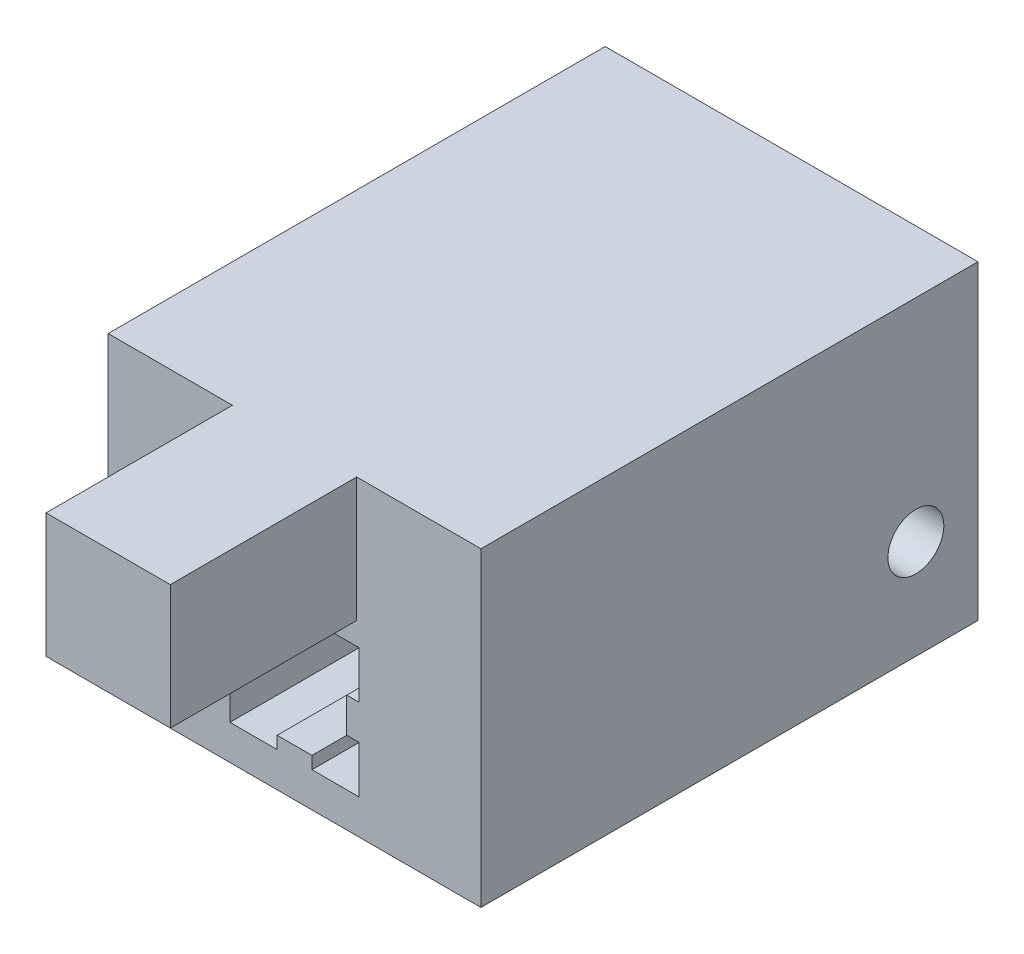
ISO-10303-21;
HEADER;
FILE_DESCRIPTION(('STEP AP214'),'2;1');
FILE_NAME('part.step','',(''),(''),'','','');
FILE_SCHEMA(('AUTOMOTIVE_DESIGN { 1 0 10303 214 1 1 1 1 }'));
ENDSEC;
DATA;
#1=APPLICATION_CONTEXT('core data for automotive mechanical design processes');
#2=APPLICATION_PROTOCOL_DEFINITION('international standard','automotive_design',2000,#1);
#3=PRODUCT_CONTEXT('',#1,'mechanical');
#4=PRODUCT('Part','Part','',(#3));
#5=PRODUCT_RELATED_PRODUCT_CATEGORY('part','',(#4));
#6=PRODUCT_DEFINITION_FORMATION('','',#4);
#7=PRODUCT_DEFINITION_CONTEXT('part definition',#1,'design');
#8=PRODUCT_DEFINITION('design','',#6,#7);
#9=PRODUCT_DEFINITION_SHAPE('','',#8);
#10=(LENGTH_UNIT() NAMED_UNIT(*) SI_UNIT(.MILLI.,.METRE.));
#11=(NAMED_UNIT(*) PLANE_ANGLE_UNIT() SI_UNIT($,.RADIAN.));
#12=(NAMED_UNIT(*) SI_UNIT($,.STERADIAN.) SOLID_ANGLE_UNIT());
#13=UNCERTAINTY_MEASURE_WITH_UNIT(LENGTH_MEASURE(1.E-05),#10,'distance_accuracy_value','');
#14=(GEOMETRIC_REPRESENTATION_CONTEXT(3) GLOBAL_UNCERTAINTY_ASSIGNED_CONTEXT((#13)) GLOBAL_UNIT_ASSIGNED_CONTEXT((#10,
#11,#12)) REPRESENTATION_CONTEXT('',''));
#15=CARTESIAN_POINT('',(0.,0.,0.));
#16=DIRECTION('',(0.,0.,1.));
#17=DIRECTION('',(1.,0.,0.));
#18=AXIS2_PLACEMENT_3D('',#15,#16,#17);
#19=CARTESIAN_POINT('',(-15.,12.5,40.));
#20=DIRECTION('',(1.,0.,0.));
#21=DIRECTION('',(0.,1.,0.));
#22=AXIS2_PLACEMENT_3D('',#19,#20,#21);
#23=PLANE('',#22);
#24=CARTESIAN_POINT('',(-15.,-4.50000000000001,5.));
#25=DIRECTION('',(-1.,0.,0.));
#26=DIRECTION('',(0.,-1.,0.));
#27=AXIS2_PLACEMENT_3D('',#24,#25,#26);
#28=CIRCLE('',#27,2.25);
#29=CARTESIAN_POINT('',(-15.,-6.75000000000001,5.));
#30=VERTEX_POINT('',#29);
#31=EDGE_CURVE('E247',#30,#30,#28,.T.);
#32=ORIENTED_EDGE('',*,*,#31,.F.);
#33=EDGE_LOOP('',(#32));
#34=FACE_BOUND('',#33,.T.);
#35=DIRECTION('',(0.,-1.,0.));
#36=VECTOR('',#35,1.);
#37=CARTESIAN_POINT('',(-15.,12.5,0.));
#38=LINE('',#37,#36);
#39=CARTESIAN_POINT('',(-15.,12.5,0.));
#40=VERTEX_POINT('',#39);
#41=CARTESIAN_POINT('',(-15.,-12.5,0.));
#42=VERTEX_POINT('',#41);
#43=EDGE_CURVE('E376',#40,#42,#38,.T.);
#44=ORIENTED_EDGE('',*,*,#43,.T.);
#45=DIRECTION('',(0.,0.,-1.));
#46=VECTOR('',#45,1.);
#47=CARTESIAN_POINT('',(-15.,-12.5,40.));
#48=LINE('',#47,#46);
#49=CARTESIAN_POINT('',(-15.,-12.5,40.));
#50=VERTEX_POINT('',#49);
#51=EDGE_CURVE('E11',#50,#42,#48,.T.);
#52=ORIENTED_EDGE('',*,*,#51,.F.);
#53=DIRECTION('',(0.,-1.,0.));
#54=VECTOR('',#53,1.);
#55=CARTESIAN_POINT('',(-15.,12.5,40.));
#56=LINE('',#55,#54);
#57=CARTESIAN_POINT('',(-15.,12.5,40.));
#58=VERTEX_POINT('',#57);
#59=EDGE_CURVE('E415',#58,#50,#56,.T.);
#60=ORIENTED_EDGE('',*,*,#59,.F.);
#61=DIRECTION('',(0.,0.,-1.));
#62=VECTOR('',#61,1.);
#63=CARTESIAN_POINT('',(-15.,12.5,40.));
#64=LINE('',#63,#62);
#65=EDGE_CURVE('E426',#58,#40,#64,.T.);
#66=ORIENTED_EDGE('',*,*,#65,.T.);
#67=EDGE_LOOP('',(#44,#52,#60,#66));
#68=FACE_BOUND('',#67,.T.);
#69=ADVANCED_FACE('F33',(#34,#68),#23,.F.);
#70=CARTESIAN_POINT('',(-15.,-12.5,40.));
#71=DIRECTION('',(0.,1.,0.));
#72=DIRECTION('',(0.,0.,1.));
#73=AXIS2_PLACEMENT_3D('',#70,#71,#72);
#74=PLANE('',#73);
#75=DIRECTION('',(1.,0.,0.));
#76=VECTOR('',#75,1.);
#77=CARTESIAN_POINT('',(-15.,-12.5,0.));
#78=LINE('',#77,#76);
#79=CARTESIAN_POINT('',(15.,-12.5,0.));
#80=VERTEX_POINT('',#79);
#81=EDGE_CURVE('E429',#42,#80,#78,.T.);
#82=ORIENTED_EDGE('',*,*,#81,.T.);
#83=DIRECTION('',(0.,0.,-1.));
#84=VECTOR('',#83,1.);
#85=CARTESIAN_POINT('',(15.,-12.5,40.));
#86=LINE('',#85,#84);
#87=CARTESIAN_POINT('',(15.,-12.5,40.));
#88=VERTEX_POINT('',#87);
#89=EDGE_CURVE('E40',#88,#80,#86,.T.);
#90=ORIENTED_EDGE('',*,*,#89,.F.);
#91=DIRECTION('',(1.,0.,0.));
#92=VECTOR('',#91,1.);
#93=CARTESIAN_POINT('',(-15.,-12.5,40.));
#94=LINE('',#93,#92);
#95=EDGE_CURVE('E418',#50,#88,#94,.T.);
#96=ORIENTED_EDGE('',*,*,#95,.F.);
#97=ORIENTED_EDGE('',*,*,#51,.T.);
#98=EDGE_LOOP('',(#82,#90,#96,#97));
#99=FACE_BOUND('',#98,.T.);
#100=ADVANCED_FACE('F480',(#99),#74,.F.);
#101=CARTESIAN_POINT('',(15.,12.5,40.));
#102=DIRECTION('',(-1.,0.,0.));
#103=DIRECTION('',(0.,-1.,0.));
#104=AXIS2_PLACEMENT_3D('',#101,#102,#103);
#105=PLANE('',#104);
#106=CARTESIAN_POINT('',(15.,-4.5,5.));
#107=DIRECTION('',(1.,0.,0.));
#108=DIRECTION('',(0.,1.,0.));
#109=AXIS2_PLACEMENT_3D('',#106,#107,#108);
#110=CIRCLE('',#109,2.25);
#111=CARTESIAN_POINT('',(15.,-2.25,5.));
#112=VERTEX_POINT('',#111);
#113=EDGE_CURVE('E237',#112,#112,#110,.T.);
#114=ORIENTED_EDGE('',*,*,#113,.F.);
#115=EDGE_LOOP('',(#114));
#116=FACE_BOUND('',#115,.T.);
#117=DIRECTION('',(0.,1.,0.));
#118=VECTOR('',#117,1.);
#119=CARTESIAN_POINT('',(15.,12.5,0.));
#120=LINE('',#119,#118);
#121=CARTESIAN_POINT('',(15.,12.5,0.));
#122=VERTEX_POINT('',#121);
#123=EDGE_CURVE('E431',#80,#122,#120,.T.);
#124=ORIENTED_EDGE('',*,*,#123,.T.);
#125=DIRECTION('',(0.,0.,-1.));
#126=VECTOR('',#125,1.);
#127=CARTESIAN_POINT('',(15.,12.5,40.));
#128=LINE('',#127,#126);
#129=CARTESIAN_POINT('',(15.,12.5,40.));
#130=VERTEX_POINT('',#129);
#131=EDGE_CURVE('E436',#130,#122,#128,.T.);
#132=ORIENTED_EDGE('',*,*,#131,.F.);
#133=DIRECTION('',(0.,1.,0.));
#134=VECTOR('',#133,1.);
#135=CARTESIAN_POINT('',(15.,12.5,40.));
#136=LINE('',#135,#134);
#137=EDGE_CURVE('E421',#88,#130,#136,.T.);
#138=ORIENTED_EDGE('',*,*,#137,.F.);
#139=ORIENTED_EDGE('',*,*,#89,.T.);
#140=EDGE_LOOP('',(#124,#132,#138,#139));
#141=FACE_BOUND('',#140,.T.);
#142=ADVANCED_FACE('F443',(#116,#141),#105,.F.);
#143=CARTESIAN_POINT('',(-15.,12.5,40.));
#144=DIRECTION('',(0.,-1.,0.));
#145=DIRECTION('',(0.,0.,-1.));
#146=AXIS2_PLACEMENT_3D('',#143,#144,#145);
#147=PLANE('',#146);
#148=DIRECTION('',(-1.,0.,0.));
#149=VECTOR('',#148,1.);
#150=CARTESIAN_POINT('',(-15.,12.5,0.));
#151=LINE('',#150,#149);
#152=EDGE_CURVE('E419',#122,#40,#151,.T.);
#153=ORIENTED_EDGE('',*,*,#152,.T.);
#154=ORIENTED_EDGE('',*,*,#65,.F.);
#155=DIRECTION('',(-1.,0.,0.));
#156=VECTOR('',#155,1.);
#157=CARTESIAN_POINT('',(-15.,12.5,40.));
#158=LINE('',#157,#156);
#159=CARTESIAN_POINT('',(-5.,12.5,40.));
#160=VERTEX_POINT('',#159);
#161=EDGE_CURVE('E423',#160,#58,#158,.T.);
#162=ORIENTED_EDGE('',*,*,#161,.F.);
#163=DIRECTION('',(0.,0.,-1.));
#164=VECTOR('',#163,1.);
#165=CARTESIAN_POINT('',(-5.,12.5,55.));
#166=LINE('',#165,#164);
#167=CARTESIAN_POINT('',(-5.,12.5,55.));
#168=VERTEX_POINT('',#167);
#169=EDGE_CURVE('E459',#168,#160,#166,.T.);
#170=ORIENTED_EDGE('',*,*,#169,.F.);
#171=DIRECTION('',(-1.,0.,0.));
#172=VECTOR('',#171,1.);
#173=CARTESIAN_POINT('',(-5.,12.5,55.));
#174=LINE('',#173,#172);
#175=CARTESIAN_POINT('',(5.,12.5,55.));
#176=VERTEX_POINT('',#175);
#177=EDGE_CURVE('E230',#176,#168,#174,.T.);
#178=ORIENTED_EDGE('',*,*,#177,.F.);
#179=DIRECTION('',(0.,0.,-1.));
#180=VECTOR('',#179,1.);
#181=CARTESIAN_POINT('',(5.,12.5,55.));
#182=LINE('',#181,#180);
#183=CARTESIAN_POINT('',(4.99999999999999,12.5,40.));
#184=VERTEX_POINT('',#183);
#185=EDGE_CURVE('E242',#176,#184,#182,.T.);
#186=ORIENTED_EDGE('',*,*,#185,.T.);
#187=EDGE_CURVE('E424',#130,#184,#158,.T.);
#188=ORIENTED_EDGE('',*,*,#187,.F.);
#189=ORIENTED_EDGE('',*,*,#131,.T.);
#190=EDGE_LOOP('',(#153,#154,#162,#170,#178,#186,#188,#189));
#191=FACE_BOUND('',#190,.T.);
#192=ADVANCED_FACE('F452',(#191),#147,.F.);
#193=CARTESIAN_POINT('',(0.,0.,40.));
#194=DIRECTION('',(0.,0.,1.));
#195=DIRECTION('',(1.,0.,0.));
#196=AXIS2_PLACEMENT_3D('',#193,#194,#195);
#197=PLANE('',#196);
#198=DIRECTION('',(0.,-1.,0.));
#199=VECTOR('',#198,1.);
#200=CARTESIAN_POINT('',(-5.,12.5,40.));
#201=LINE('',#200,#199);
#202=CARTESIAN_POINT('',(-4.99999999999999,2.5,40.));
#203=VERTEX_POINT('',#202);
#204=EDGE_CURVE('E52',#160,#203,#201,.T.);
#205=ORIENTED_EDGE('',*,*,#204,.F.);
#206=ORIENTED_EDGE('',*,*,#161,.T.);
#207=ORIENTED_EDGE('',*,*,#59,.T.);
#208=ORIENTED_EDGE('',*,*,#95,.T.);
#209=ORIENTED_EDGE('',*,*,#137,.T.);
#210=ORIENTED_EDGE('',*,*,#187,.T.);
#211=DIRECTION('',(0.,1.,0.));
#212=VECTOR('',#211,1.);
#213=CARTESIAN_POINT('',(5.,12.5,40.));
#214=LINE('',#213,#212);
#215=CARTESIAN_POINT('',(5.,2.5,40.));
#216=VERTEX_POINT('',#215);
#217=EDGE_CURVE('E234',#216,#184,#214,.T.);
#218=ORIENTED_EDGE('',*,*,#217,.F.);
#219=DIRECTION('',(1.,0.,0.));
#220=VECTOR('',#219,1.);
#221=CARTESIAN_POINT('',(-4.99999999999999,2.5,40.));
#222=LINE('',#221,#220);
#223=EDGE_CURVE('E47',#203,#216,#222,.T.);
#224=ORIENTED_EDGE('',*,*,#223,.F.);
#225=EDGE_LOOP('',(#205,#206,#207,#208,#209,#210,#218,#224));
#226=FACE_BOUND('',#225,.T.);
#227=DIRECTION('',(1.,0.,0.));
#228=VECTOR('',#227,1.);
#229=CARTESIAN_POINT('',(1.4,0.699999999999995,40.));
#230=LINE('',#229,#228);
#231=CARTESIAN_POINT('',(1.4,0.699999999999995,40.));
#232=VERTEX_POINT('',#231);
#233=CARTESIAN_POINT('',(5.19999999999999,0.700000000000001,40.));
#234=VERTEX_POINT('',#233);
#235=EDGE_CURVE('E255',#232,#234,#230,.T.);
#236=ORIENTED_EDGE('',*,*,#235,.T.);
#237=DIRECTION('',(0.,-1.,0.));
#238=VECTOR('',#237,1.);
#239=CARTESIAN_POINT('',(5.19999999999999,0.700000000000001,40.));
#240=LINE('',#239,#238);
#241=CARTESIAN_POINT('',(5.2,-3.1,40.));
#242=VERTEX_POINT('',#241);
#243=EDGE_CURVE('E258',#234,#242,#240,.T.);
#244=ORIENTED_EDGE('',*,*,#243,.T.);
#245=DIRECTION('',(-1.,0.,0.));
#246=VECTOR('',#245,1.);
#247=CARTESIAN_POINT('',(5.2,-3.1,40.));
#248=LINE('',#247,#246);
#249=CARTESIAN_POINT('',(4.2,-3.1,40.));
#250=VERTEX_POINT('',#249);
#251=EDGE_CURVE('E262',#242,#250,#248,.T.);
#252=ORIENTED_EDGE('',*,*,#251,.T.);
#253=DIRECTION('',(0.,-1.,0.));
#254=VECTOR('',#253,1.);
#255=CARTESIAN_POINT('',(4.2,-3.1,40.));
#256=LINE('',#255,#254);
#257=CARTESIAN_POINT('',(4.2,-5.9,40.));
#258=VERTEX_POINT('',#257);
#259=EDGE_CURVE('E265',#250,#258,#256,.T.);
#260=ORIENTED_EDGE('',*,*,#259,.T.);
#261=DIRECTION('',(1.,0.,0.));
#262=VECTOR('',#261,1.);
#263=CARTESIAN_POINT('',(4.2,-5.9,40.));
#264=LINE('',#263,#262);
#265=CARTESIAN_POINT('',(5.2,-5.9,40.));
#266=VERTEX_POINT('',#265);
#267=EDGE_CURVE('E268',#258,#266,#264,.T.);
#268=ORIENTED_EDGE('',*,*,#267,.T.);
#269=DIRECTION('',(0.,-1.,0.));
#270=VECTOR('',#269,1.);
#271=CARTESIAN_POINT('',(5.2,-5.9,40.));
#272=LINE('',#271,#270);
#273=CARTESIAN_POINT('',(5.20000000000001,-9.7,40.));
#274=VERTEX_POINT('',#273);
#275=EDGE_CURVE('E271',#266,#274,#272,.T.);
#276=ORIENTED_EDGE('',*,*,#275,.T.);
#277=DIRECTION('',(-1.,0.,0.));
#278=VECTOR('',#277,1.);
#279=CARTESIAN_POINT('',(5.20000000000001,-9.7,40.));
#280=LINE('',#279,#278);
#281=CARTESIAN_POINT('',(1.4,-9.7,40.));
#282=VERTEX_POINT('',#281);
#283=EDGE_CURVE('E274',#274,#282,#280,.T.);
#284=ORIENTED_EDGE('',*,*,#283,.T.);
#285=DIRECTION('',(0.,1.,0.));
#286=VECTOR('',#285,1.);
#287=CARTESIAN_POINT('',(1.4,-9.7,40.));
#288=LINE('',#287,#286);
#289=CARTESIAN_POINT('',(1.4,-8.7,40.));
#290=VERTEX_POINT('',#289);
#291=EDGE_CURVE('E277',#282,#290,#288,.T.);
#292=ORIENTED_EDGE('',*,*,#291,.T.);
#293=DIRECTION('',(-1.,0.,0.));
#294=VECTOR('',#293,1.);
#295=CARTESIAN_POINT('',(1.4,-8.7,40.));
#296=LINE('',#295,#294);
#297=CARTESIAN_POINT('',(-1.4,-8.7,40.));
#298=VERTEX_POINT('',#297);
#299=EDGE_CURVE('E280',#290,#298,#296,.T.);
#300=ORIENTED_EDGE('',*,*,#299,.T.);
#301=DIRECTION('',(0.,-1.,0.));
#302=VECTOR('',#301,1.);
#303=CARTESIAN_POINT('',(-1.4,-8.7,40.));
#304=LINE('',#303,#302);
#305=CARTESIAN_POINT('',(-1.4,-9.7,40.));
#306=VERTEX_POINT('',#305);
#307=EDGE_CURVE('E283',#298,#306,#304,.T.);
#308=ORIENTED_EDGE('',*,*,#307,.T.);
#309=DIRECTION('',(-1.,0.,0.));
#310=VECTOR('',#309,1.);
#311=CARTESIAN_POINT('',(-1.4,-9.7,40.));
#312=LINE('',#311,#310);
#313=CARTESIAN_POINT('',(-5.20000000000001,-9.7,40.));
#314=VERTEX_POINT('',#313);
#315=EDGE_CURVE('E286',#306,#314,#312,.T.);
#316=ORIENTED_EDGE('',*,*,#315,.T.);
#317=DIRECTION('',(0.,1.,0.));
#318=VECTOR('',#317,1.);
#319=CARTESIAN_POINT('',(-5.20000000000001,-9.7,40.));
#320=LINE('',#319,#318);
#321=CARTESIAN_POINT('',(-5.2,-5.9,40.));
#322=VERTEX_POINT('',#321);
#323=EDGE_CURVE('E289',#314,#322,#320,.T.);
#324=ORIENTED_EDGE('',*,*,#323,.T.);
#325=DIRECTION('',(1.,0.,0.));
#326=VECTOR('',#325,1.);
#327=CARTESIAN_POINT('',(-5.2,-5.9,40.));
#328=LINE('',#327,#326);
#329=CARTESIAN_POINT('',(-4.2,-5.9,40.));
#330=VERTEX_POINT('',#329);
#331=EDGE_CURVE('E292',#322,#330,#328,.T.);
#332=ORIENTED_EDGE('',*,*,#331,.T.);
#333=DIRECTION('',(0.,1.,0.));
#334=VECTOR('',#333,1.);
#335=CARTESIAN_POINT('',(-4.2,-5.9,40.));
#336=LINE('',#335,#334);
#337=CARTESIAN_POINT('',(-4.2,-3.1,40.));
#338=VERTEX_POINT('',#337);
#339=EDGE_CURVE('E295',#330,#338,#336,.T.);
#340=ORIENTED_EDGE('',*,*,#339,.T.);
#341=DIRECTION('',(-1.,0.,0.));
#342=VECTOR('',#341,1.);
#343=CARTESIAN_POINT('',(-4.2,-3.1,40.));
#344=LINE('',#343,#342);
#345=CARTESIAN_POINT('',(-5.2,-3.1,40.));
#346=VERTEX_POINT('',#345);
#347=EDGE_CURVE('E298',#338,#346,#344,.T.);
#348=ORIENTED_EDGE('',*,*,#347,.T.);
#349=DIRECTION('',(0.,1.,0.));
#350=VECTOR('',#349,1.);
#351=CARTESIAN_POINT('',(-5.2,-3.1,40.));
#352=LINE('',#351,#350);
#353=CARTESIAN_POINT('',(-5.20000000000001,0.699999999999987,40.));
#354=VERTEX_POINT('',#353);
#355=EDGE_CURVE('E301',#346,#354,#352,.T.);
#356=ORIENTED_EDGE('',*,*,#355,.T.);
#357=DIRECTION('',(1.,0.,0.));
#358=VECTOR('',#357,1.);
#359=CARTESIAN_POINT('',(-5.20000000000001,0.699999999999987,40.));
#360=LINE('',#359,#358);
#361=CARTESIAN_POINT('',(-1.4,0.699999999999995,40.));
#362=VERTEX_POINT('',#361);
#363=EDGE_CURVE('E304',#354,#362,#360,.T.);
#364=ORIENTED_EDGE('',*,*,#363,.T.);
#365=DIRECTION('',(0.,-1.,0.));
#366=VECTOR('',#365,1.);
#367=CARTESIAN_POINT('',(-1.4,0.699999999999995,40.));
#368=LINE('',#367,#366);
#369=CARTESIAN_POINT('',(-1.4,-0.300000000000005,40.));
#370=VERTEX_POINT('',#369);
#371=EDGE_CURVE('E307',#362,#370,#368,.T.);
#372=ORIENTED_EDGE('',*,*,#371,.T.);
#373=DIRECTION('',(1.,0.,0.));
#374=VECTOR('',#373,1.);
#375=CARTESIAN_POINT('',(-1.4,-0.300000000000005,40.));
#376=LINE('',#375,#374);
#377=CARTESIAN_POINT('',(1.4,-0.300000000000005,40.));
#378=VERTEX_POINT('',#377);
#379=EDGE_CURVE('E310',#370,#378,#376,.T.);
#380=ORIENTED_EDGE('',*,*,#379,.T.);
#381=DIRECTION('',(0.,1.,0.));
#382=VECTOR('',#381,1.);
#383=CARTESIAN_POINT('',(1.4,-0.300000000000005,40.));
#384=LINE('',#383,#382);
#385=EDGE_CURVE('E313',#378,#232,#384,.T.);
#386=ORIENTED_EDGE('',*,*,#385,.T.);
#387=EDGE_LOOP('',(#236,#244,#252,#260,#268,#276,#284,#292,#300,#308,#316,#324,#332,#340,#348,
#356,#364,#372,#380,#386));
#388=FACE_BOUND('',#387,.T.);
#389=ADVANCED_FACE('F457',(#226,#388),#197,.T.);
#390=CARTESIAN_POINT('',(0.,0.,0.));
#391=DIRECTION('',(0.,0.,1.));
#392=DIRECTION('',(1.,0.,0.));
#393=AXIS2_PLACEMENT_3D('',#390,#391,#392);
#394=PLANE('',#393);
#395=DIRECTION('',(0.,-1.,0.));
#396=VECTOR('',#395,1.);
#397=CARTESIAN_POINT('',(5.19999999999999,0.700000000000001,0.));
#398=LINE('',#397,#396);
#399=CARTESIAN_POINT('',(5.19999999999999,0.700000000000001,0.));
#400=VERTEX_POINT('',#399);
#401=CARTESIAN_POINT('',(5.2,-3.1,0.));
#402=VERTEX_POINT('',#401);
#403=EDGE_CURVE('E318',#400,#402,#398,.T.);
#404=ORIENTED_EDGE('',*,*,#403,.F.);
#405=DIRECTION('',(1.,0.,0.));
#406=VECTOR('',#405,1.);
#407=CARTESIAN_POINT('',(1.4,0.699999999999995,0.));
#408=LINE('',#407,#406);
#409=CARTESIAN_POINT('',(1.4,0.699999999999995,0.));
#410=VERTEX_POINT('',#409);
#411=EDGE_CURVE('E252',#410,#400,#408,.T.);
#412=ORIENTED_EDGE('',*,*,#411,.F.);
#413=DIRECTION('',(0.,1.,0.));
#414=VECTOR('',#413,1.);
#415=CARTESIAN_POINT('',(1.4,-0.300000000000005,0.));
#416=LINE('',#415,#414);
#417=CARTESIAN_POINT('',(1.4,-0.300000000000005,0.));
#418=VERTEX_POINT('',#417);
#419=EDGE_CURVE('E259',#418,#410,#416,.T.);
#420=ORIENTED_EDGE('',*,*,#419,.F.);
#421=DIRECTION('',(1.,0.,0.));
#422=VECTOR('',#421,1.);
#423=CARTESIAN_POINT('',(-1.4,-0.300000000000005,0.));
#424=LINE('',#423,#422);
#425=CARTESIAN_POINT('',(-1.4,-0.300000000000005,0.));
#426=VERTEX_POINT('',#425);
#427=EDGE_CURVE('E369',#426,#418,#424,.T.);
#428=ORIENTED_EDGE('',*,*,#427,.F.);
#429=DIRECTION('',(0.,-1.,0.));
#430=VECTOR('',#429,1.);
#431=CARTESIAN_POINT('',(-1.4,0.699999999999995,0.));
#432=LINE('',#431,#430);
#433=CARTESIAN_POINT('',(-1.4,0.699999999999995,0.));
#434=VERTEX_POINT('',#433);
#435=EDGE_CURVE('E366',#434,#426,#432,.T.);
#436=ORIENTED_EDGE('',*,*,#435,.F.);
#437=DIRECTION('',(1.,0.,0.));
#438=VECTOR('',#437,1.);
#439=CARTESIAN_POINT('',(-5.20000000000001,0.699999999999987,0.));
#440=LINE('',#439,#438);
#441=CARTESIAN_POINT('',(-5.20000000000001,0.699999999999987,0.));
#442=VERTEX_POINT('',#441);
#443=EDGE_CURVE('E363',#442,#434,#440,.T.);
#444=ORIENTED_EDGE('',*,*,#443,.F.);
#445=DIRECTION('',(0.,1.,0.));
#446=VECTOR('',#445,1.);
#447=CARTESIAN_POINT('',(-5.2,-3.1,0.));
#448=LINE('',#447,#446);
#449=CARTESIAN_POINT('',(-5.2,-3.1,0.));
#450=VERTEX_POINT('',#449);
#451=EDGE_CURVE('E360',#450,#442,#448,.T.);
#452=ORIENTED_EDGE('',*,*,#451,.F.);
#453=DIRECTION('',(-1.,0.,0.));
#454=VECTOR('',#453,1.);
#455=CARTESIAN_POINT('',(-4.2,-3.1,0.));
#456=LINE('',#455,#454);
#457=CARTESIAN_POINT('',(-4.2,-3.1,0.));
#458=VERTEX_POINT('',#457);
#459=EDGE_CURVE('E357',#458,#450,#456,.T.);
#460=ORIENTED_EDGE('',*,*,#459,.F.);
#461=DIRECTION('',(0.,1.,0.));
#462=VECTOR('',#461,1.);
#463=CARTESIAN_POINT('',(-4.2,-5.9,0.));
#464=LINE('',#463,#462);
#465=CARTESIAN_POINT('',(-4.2,-5.9,0.));
#466=VERTEX_POINT('',#465);
#467=EDGE_CURVE('E354',#466,#458,#464,.T.);
#468=ORIENTED_EDGE('',*,*,#467,.F.);
#469=DIRECTION('',(1.,0.,0.));
#470=VECTOR('',#469,1.);
#471=CARTESIAN_POINT('',(-5.2,-5.9,0.));
#472=LINE('',#471,#470);
#473=CARTESIAN_POINT('',(-5.2,-5.9,0.));
#474=VERTEX_POINT('',#473);
#475=EDGE_CURVE('E351',#474,#466,#472,.T.);
#476=ORIENTED_EDGE('',*,*,#475,.F.);
#477=DIRECTION('',(0.,1.,0.));
#478=VECTOR('',#477,1.);
#479=CARTESIAN_POINT('',(-5.20000000000001,-9.7,0.));
#480=LINE('',#479,#478);
#481=CARTESIAN_POINT('',(-5.20000000000001,-9.7,0.));
#482=VERTEX_POINT('',#481);
#483=EDGE_CURVE('E348',#482,#474,#480,.T.);
#484=ORIENTED_EDGE('',*,*,#483,.F.);
#485=DIRECTION('',(-1.,0.,0.));
#486=VECTOR('',#485,1.);
#487=CARTESIAN_POINT('',(-1.4,-9.7,0.));
#488=LINE('',#487,#486);
#489=CARTESIAN_POINT('',(-1.4,-9.7,0.));
#490=VERTEX_POINT('',#489);
#491=EDGE_CURVE('E345',#490,#482,#488,.T.);
#492=ORIENTED_EDGE('',*,*,#491,.F.);
#493=DIRECTION('',(0.,-1.,0.));
#494=VECTOR('',#493,1.);
#495=CARTESIAN_POINT('',(-1.4,-8.7,0.));
#496=LINE('',#495,#494);
#497=CARTESIAN_POINT('',(-1.4,-8.7,0.));
#498=VERTEX_POINT('',#497);
#499=EDGE_CURVE('E342',#498,#490,#496,.T.);
#500=ORIENTED_EDGE('',*,*,#499,.F.);
#501=DIRECTION('',(-1.,0.,0.));
#502=VECTOR('',#501,1.);
#503=CARTESIAN_POINT('',(1.4,-8.7,0.));
#504=LINE('',#503,#502);
#505=CARTESIAN_POINT('',(1.4,-8.7,0.));
#506=VERTEX_POINT('',#505);
#507=EDGE_CURVE('E339',#506,#498,#504,.T.);
#508=ORIENTED_EDGE('',*,*,#507,.F.);
#509=DIRECTION('',(0.,1.,0.));
#510=VECTOR('',#509,1.);
#511=CARTESIAN_POINT('',(1.4,-9.7,0.));
#512=LINE('',#511,#510);
#513=CARTESIAN_POINT('',(1.4,-9.7,0.));
#514=VERTEX_POINT('',#513);
#515=EDGE_CURVE('E336',#514,#506,#512,.T.);
#516=ORIENTED_EDGE('',*,*,#515,.F.);
#517=DIRECTION('',(-1.,0.,0.));
#518=VECTOR('',#517,1.);
#519=CARTESIAN_POINT('',(5.20000000000001,-9.7,0.));
#520=LINE('',#519,#518);
#521=CARTESIAN_POINT('',(5.20000000000001,-9.7,0.));
#522=VERTEX_POINT('',#521);
#523=EDGE_CURVE('E333',#522,#514,#520,.T.);
#524=ORIENTED_EDGE('',*,*,#523,.F.);
#525=DIRECTION('',(0.,-1.,0.));
#526=VECTOR('',#525,1.);
#527=CARTESIAN_POINT('',(5.2,-5.9,0.));
#528=LINE('',#527,#526);
#529=CARTESIAN_POINT('',(5.2,-5.9,0.));
#530=VERTEX_POINT('',#529);
#531=EDGE_CURVE('E330',#530,#522,#528,.T.);
#532=ORIENTED_EDGE('',*,*,#531,.F.);
#533=DIRECTION('',(1.,0.,0.));
#534=VECTOR('',#533,1.);
#535=CARTESIAN_POINT('',(4.2,-5.9,0.));
#536=LINE('',#535,#534);
#537=CARTESIAN_POINT('',(4.2,-5.9,0.));
#538=VERTEX_POINT('',#537);
#539=EDGE_CURVE('E327',#538,#530,#536,.T.);
#540=ORIENTED_EDGE('',*,*,#539,.F.);
#541=DIRECTION('',(0.,-1.,0.));
#542=VECTOR('',#541,1.);
#543=CARTESIAN_POINT('',(4.2,-3.1,0.));
#544=LINE('',#543,#542);
#545=CARTESIAN_POINT('',(4.2,-3.1,0.));
#546=VERTEX_POINT('',#545);
#547=EDGE_CURVE('E324',#546,#538,#544,.T.);
#548=ORIENTED_EDGE('',*,*,#547,.F.);
#549=DIRECTION('',(-1.,0.,0.));
#550=VECTOR('',#549,1.);
#551=CARTESIAN_POINT('',(5.2,-3.1,0.));
#552=LINE('',#551,#550);
#553=EDGE_CURVE('E321',#402,#546,#552,.T.);
#554=ORIENTED_EDGE('',*,*,#553,.F.);
#555=EDGE_LOOP('',(#404,#412,#420,#428,#436,#444,#452,#460,#468,#476,#484,#492,#500,#508,#516,
#524,#532,#540,#548,#554));
#556=FACE_BOUND('',#555,.T.);
#557=ORIENTED_EDGE('',*,*,#43,.F.);
#558=ORIENTED_EDGE('',*,*,#152,.F.);
#559=ORIENTED_EDGE('',*,*,#123,.F.);
#560=ORIENTED_EDGE('',*,*,#81,.F.);
#561=EDGE_LOOP('',(#557,#558,#559,#560));
#562=FACE_BOUND('',#561,.T.);
#563=ADVANCED_FACE('F449',(#556,#562),#394,.F.);
#564=CARTESIAN_POINT('',(1.4,0.699999999999995,40.));
#565=DIRECTION('',(0.,1.,0.));
#566=DIRECTION('',(-1.,0.,0.));
#567=AXIS2_PLACEMENT_3D('',#564,#565,#566);
#568=PLANE('',#567);
#569=ORIENTED_EDGE('',*,*,#411,.T.);
#570=DIRECTION('',(0.,0.,-1.));
#571=VECTOR('',#570,1.);
#572=CARTESIAN_POINT('',(5.19999999999999,0.700000000000001,40.));
#573=LINE('',#572,#571);
#574=EDGE_CURVE('E316',#234,#400,#573,.T.);
#575=ORIENTED_EDGE('',*,*,#574,.F.);
#576=ORIENTED_EDGE('',*,*,#235,.F.);
#577=DIRECTION('',(0.,0.,-1.));
#578=VECTOR('',#577,1.);
#579=CARTESIAN_POINT('',(1.4,0.699999999999995,40.));
#580=LINE('',#579,#578);
#581=EDGE_CURVE('E374',#232,#410,#580,.T.);
#582=ORIENTED_EDGE('',*,*,#581,.T.);
#583=EDGE_LOOP('',(#569,#575,#576,#582));
#584=FACE_BOUND('',#583,.T.);
#585=ADVANCED_FACE('F510',(#584),#568,.F.);
#586=CARTESIAN_POINT('',(1.4,-0.300000000000005,40.));
#587=DIRECTION('',(-1.,0.,0.));
#588=DIRECTION('',(0.,-1.,0.));
#589=AXIS2_PLACEMENT_3D('',#586,#587,#588);
#590=PLANE('',#589);
#591=ORIENTED_EDGE('',*,*,#419,.T.);
#592=ORIENTED_EDGE('',*,*,#581,.F.);
#593=ORIENTED_EDGE('',*,*,#385,.F.);
#594=DIRECTION('',(0.,0.,-1.));
#595=VECTOR('',#594,1.);
#596=CARTESIAN_POINT('',(1.4,-0.300000000000005,40.));
#597=LINE('',#596,#595);
#598=EDGE_CURVE('E377',#378,#418,#597,.T.);
#599=ORIENTED_EDGE('',*,*,#598,.T.);
#600=EDGE_LOOP('',(#591,#592,#593,#599));
#601=FACE_BOUND('',#600,.T.);
#602=ADVANCED_FACE('F506',(#601),#590,.F.);
#603=CARTESIAN_POINT('',(-1.4,-0.300000000000005,40.));
#604=DIRECTION('',(0.,1.,0.));
#605=DIRECTION('',(-1.,0.,0.));
#606=AXIS2_PLACEMENT_3D('',#603,#604,#605);
#607=PLANE('',#606);
#608=ORIENTED_EDGE('',*,*,#427,.T.);
#609=ORIENTED_EDGE('',*,*,#598,.F.);
#610=ORIENTED_EDGE('',*,*,#379,.F.);
#611=DIRECTION('',(0.,0.,-1.));
#612=VECTOR('',#611,1.);
#613=CARTESIAN_POINT('',(-1.4,-0.300000000000005,40.));
#614=LINE('',#613,#612);
#615=EDGE_CURVE('E379',#370,#426,#614,.T.);
#616=ORIENTED_EDGE('',*,*,#615,.T.);
#617=EDGE_LOOP('',(#608,#609,#610,#616));
#618=FACE_BOUND('',#617,.T.);
#619=ADVANCED_FACE('F509',(#618),#607,.F.);
#620=CARTESIAN_POINT('',(-1.4,0.699999999999995,40.));
#621=DIRECTION('',(1.,0.,0.));
#622=DIRECTION('',(0.,0.,-1.));
#623=AXIS2_PLACEMENT_3D('',#620,#621,#622);
#624=PLANE('',#623);
#625=ORIENTED_EDGE('',*,*,#435,.T.);
#626=ORIENTED_EDGE('',*,*,#615,.F.);
#627=ORIENTED_EDGE('',*,*,#371,.F.);
#628=DIRECTION('',(0.,0.,-1.));
#629=VECTOR('',#628,1.);
#630=CARTESIAN_POINT('',(-1.4,0.699999999999995,40.));
#631=LINE('',#630,#629);
#632=EDGE_CURVE('E381',#362,#434,#631,.T.);
#633=ORIENTED_EDGE('',*,*,#632,.T.);
#634=EDGE_LOOP('',(#625,#626,#627,#633));
#635=FACE_BOUND('',#634,.T.);
#636=ADVANCED_FACE('F514',(#635),#624,.F.);
#637=CARTESIAN_POINT('',(-5.20000000000001,0.699999999999987,40.));
#638=DIRECTION('',(0.,1.,0.));
#639=DIRECTION('',(-1.,0.,0.));
#640=AXIS2_PLACEMENT_3D('',#637,#638,#639);
#641=PLANE('',#640);
#642=ORIENTED_EDGE('',*,*,#443,.T.);
#643=ORIENTED_EDGE('',*,*,#632,.F.);
#644=ORIENTED_EDGE('',*,*,#363,.F.);
#645=DIRECTION('',(0.,0.,-1.));
#646=VECTOR('',#645,1.);
#647=CARTESIAN_POINT('',(-5.20000000000001,0.699999999999987,40.));
#648=LINE('',#647,#646);
#649=EDGE_CURVE('E383',#354,#442,#648,.T.);
#650=ORIENTED_EDGE('',*,*,#649,.T.);
#651=EDGE_LOOP('',(#642,#643,#644,#650));
#652=FACE_BOUND('',#651,.T.);
#653=ADVANCED_FACE('F518',(#652),#641,.F.);
#654=CARTESIAN_POINT('',(-5.2,-3.1,40.));
#655=DIRECTION('',(-1.,0.,0.));
#656=DIRECTION('',(0.,-1.,0.));
#657=AXIS2_PLACEMENT_3D('',#654,#655,#656);
#658=PLANE('',#657);
#659=ORIENTED_EDGE('',*,*,#451,.T.);
#660=ORIENTED_EDGE('',*,*,#649,.F.);
#661=ORIENTED_EDGE('',*,*,#355,.F.);
#662=DIRECTION('',(0.,0.,-1.));
#663=VECTOR('',#662,1.);
#664=CARTESIAN_POINT('',(-5.2,-3.1,40.));
#665=LINE('',#664,#663);
#666=EDGE_CURVE('E385',#346,#450,#665,.T.);
#667=ORIENTED_EDGE('',*,*,#666,.T.);
#668=EDGE_LOOP('',(#659,#660,#661,#667));
#669=FACE_BOUND('',#668,.T.);
#670=ADVANCED_FACE('F522',(#669),#658,.F.);
#671=CARTESIAN_POINT('',(-4.2,-3.1,40.));
#672=DIRECTION('',(0.,-1.,0.));
#673=DIRECTION('',(1.,0.,0.));
#674=AXIS2_PLACEMENT_3D('',#671,#672,#673);
#675=PLANE('',#674);
#676=ORIENTED_EDGE('',*,*,#459,.T.);
#677=ORIENTED_EDGE('',*,*,#666,.F.);
#678=ORIENTED_EDGE('',*,*,#347,.F.);
#679=DIRECTION('',(0.,0.,-1.));
#680=VECTOR('',#679,1.);
#681=CARTESIAN_POINT('',(-4.2,-3.1,40.));
#682=LINE('',#681,#680);
#683=EDGE_CURVE('E387',#338,#458,#682,.T.);
#684=ORIENTED_EDGE('',*,*,#683,.T.);
#685=EDGE_LOOP('',(#676,#677,#678,#684));
#686=FACE_BOUND('',#685,.T.);
#687=ADVANCED_FACE('F526',(#686),#675,.F.);
#688=CARTESIAN_POINT('',(-4.2,-5.9,40.));
#689=DIRECTION('',(-1.,0.,0.));
#690=DIRECTION('',(0.,0.,1.));
#691=AXIS2_PLACEMENT_3D('',#688,#689,#690);
#692=PLANE('',#691);
#693=ORIENTED_EDGE('',*,*,#467,.T.);
#694=ORIENTED_EDGE('',*,*,#683,.F.);
#695=ORIENTED_EDGE('',*,*,#339,.F.);
#696=DIRECTION('',(0.,0.,-1.));
#697=VECTOR('',#696,1.);
#698=CARTESIAN_POINT('',(-4.2,-5.9,40.));
#699=LINE('',#698,#697);
#700=EDGE_CURVE('E389',#330,#466,#699,.T.);
#701=ORIENTED_EDGE('',*,*,#700,.T.);
#702=EDGE_LOOP('',(#693,#694,#695,#701));
#703=FACE_BOUND('',#702,.T.);
#704=ADVANCED_FACE('F530',(#703),#692,.F.);
#705=CARTESIAN_POINT('',(-5.2,-5.9,40.));
#706=DIRECTION('',(0.,1.,0.));
#707=DIRECTION('',(0.,0.,1.));
#708=AXIS2_PLACEMENT_3D('',#705,#706,#707);
#709=PLANE('',#708);
#710=ORIENTED_EDGE('',*,*,#475,.T.);
#711=ORIENTED_EDGE('',*,*,#700,.F.);
#712=ORIENTED_EDGE('',*,*,#331,.F.);
#713=DIRECTION('',(0.,0.,-1.));
#714=VECTOR('',#713,1.);
#715=CARTESIAN_POINT('',(-5.2,-5.9,40.));
#716=LINE('',#715,#714);
#717=EDGE_CURVE('E391',#322,#474,#716,.T.);
#718=ORIENTED_EDGE('',*,*,#717,.T.);
#719=EDGE_LOOP('',(#710,#711,#712,#718));
#720=FACE_BOUND('',#719,.T.);
#721=ADVANCED_FACE('F534',(#720),#709,.F.);
#722=CARTESIAN_POINT('',(-5.20000000000001,-9.7,40.));
#723=DIRECTION('',(-1.,0.,0.));
#724=DIRECTION('',(0.,-1.,0.));
#725=AXIS2_PLACEMENT_3D('',#722,#723,#724);
#726=PLANE('',#725);
#727=ORIENTED_EDGE('',*,*,#483,.T.);
#728=ORIENTED_EDGE('',*,*,#717,.F.);
#729=ORIENTED_EDGE('',*,*,#323,.F.);
#730=DIRECTION('',(0.,0.,-1.));
#731=VECTOR('',#730,1.);
#732=CARTESIAN_POINT('',(-5.20000000000001,-9.7,40.));
#733=LINE('',#732,#731);
#734=EDGE_CURVE('E393',#314,#482,#733,.T.);
#735=ORIENTED_EDGE('',*,*,#734,.T.);
#736=EDGE_LOOP('',(#727,#728,#729,#735));
#737=FACE_BOUND('',#736,.T.);
#738=ADVANCED_FACE('F538',(#737),#726,.F.);
#739=CARTESIAN_POINT('',(-1.4,-9.7,40.));
#740=DIRECTION('',(0.,-1.,0.));
#741=DIRECTION('',(1.,0.,0.));
#742=AXIS2_PLACEMENT_3D('',#739,#740,#741);
#743=PLANE('',#742);
#744=ORIENTED_EDGE('',*,*,#491,.T.);
#745=ORIENTED_EDGE('',*,*,#734,.F.);
#746=ORIENTED_EDGE('',*,*,#315,.F.);
#747=DIRECTION('',(0.,0.,-1.));
#748=VECTOR('',#747,1.);
#749=CARTESIAN_POINT('',(-1.4,-9.7,40.));
#750=LINE('',#749,#748);
#751=EDGE_CURVE('E395',#306,#490,#750,.T.);
#752=ORIENTED_EDGE('',*,*,#751,.T.);
#753=EDGE_LOOP('',(#744,#745,#746,#752));
#754=FACE_BOUND('',#753,.T.);
#755=ADVANCED_FACE('F542',(#754),#743,.F.);
#756=CARTESIAN_POINT('',(-1.4,-8.7,40.));
#757=DIRECTION('',(1.,0.,0.));
#758=DIRECTION('',(0.,0.,-1.));
#759=AXIS2_PLACEMENT_3D('',#756,#757,#758);
#760=PLANE('',#759);
#761=ORIENTED_EDGE('',*,*,#499,.T.);
#762=ORIENTED_EDGE('',*,*,#751,.F.);
#763=ORIENTED_EDGE('',*,*,#307,.F.);
#764=DIRECTION('',(0.,0.,-1.));
#765=VECTOR('',#764,1.);
#766=CARTESIAN_POINT('',(-1.4,-8.7,40.));
#767=LINE('',#766,#765);
#768=EDGE_CURVE('E397',#298,#498,#767,.T.);
#769=ORIENTED_EDGE('',*,*,#768,.T.);
#770=EDGE_LOOP('',(#761,#762,#763,#769));
#771=FACE_BOUND('',#770,.T.);
#772=ADVANCED_FACE('F546',(#771),#760,.F.);
#773=CARTESIAN_POINT('',(1.4,-8.7,40.));
#774=DIRECTION('',(0.,-1.,0.));
#775=DIRECTION('',(1.,0.,0.));
#776=AXIS2_PLACEMENT_3D('',#773,#774,#775);
#777=PLANE('',#776);
#778=ORIENTED_EDGE('',*,*,#507,.T.);
#779=ORIENTED_EDGE('',*,*,#768,.F.);
#780=ORIENTED_EDGE('',*,*,#299,.F.);
#781=DIRECTION('',(0.,0.,-1.));
#782=VECTOR('',#781,1.);
#783=CARTESIAN_POINT('',(1.4,-8.7,40.));
#784=LINE('',#783,#782);
#785=EDGE_CURVE('E399',#290,#506,#784,.T.);
#786=ORIENTED_EDGE('',*,*,#785,.T.);
#787=EDGE_LOOP('',(#778,#779,#780,#786));
#788=FACE_BOUND('',#787,.T.);
#789=ADVANCED_FACE('F550',(#788),#777,.F.);
#790=CARTESIAN_POINT('',(1.4,-9.7,40.));
#791=DIRECTION('',(-1.,0.,0.));
#792=DIRECTION('',(0.,-1.,0.));
#793=AXIS2_PLACEMENT_3D('',#790,#791,#792);
#794=PLANE('',#793);
#795=ORIENTED_EDGE('',*,*,#515,.T.);
#796=ORIENTED_EDGE('',*,*,#785,.F.);
#797=ORIENTED_EDGE('',*,*,#291,.F.);
#798=DIRECTION('',(0.,0.,-1.));
#799=VECTOR('',#798,1.);
#800=CARTESIAN_POINT('',(1.4,-9.7,40.));
#801=LINE('',#800,#799);
#802=EDGE_CURVE('E401',#282,#514,#801,.T.);
#803=ORIENTED_EDGE('',*,*,#802,.T.);
#804=EDGE_LOOP('',(#795,#796,#797,#803));
#805=FACE_BOUND('',#804,.T.);
#806=ADVANCED_FACE('F554',(#805),#794,.F.);
#807=CARTESIAN_POINT('',(5.20000000000001,-9.7,40.));
#808=DIRECTION('',(0.,-1.,0.));
#809=DIRECTION('',(1.,0.,0.));
#810=AXIS2_PLACEMENT_3D('',#807,#808,#809);
#811=PLANE('',#810);
#812=ORIENTED_EDGE('',*,*,#523,.T.);
#813=ORIENTED_EDGE('',*,*,#802,.F.);
#814=ORIENTED_EDGE('',*,*,#283,.F.);
#815=DIRECTION('',(0.,0.,-1.));
#816=VECTOR('',#815,1.);
#817=CARTESIAN_POINT('',(5.20000000000001,-9.7,40.));
#818=LINE('',#817,#816);
#819=EDGE_CURVE('E403',#274,#522,#818,.T.);
#820=ORIENTED_EDGE('',*,*,#819,.T.);
#821=EDGE_LOOP('',(#812,#813,#814,#820));
#822=FACE_BOUND('',#821,.T.);
#823=ADVANCED_FACE('F558',(#822),#811,.F.);
#824=CARTESIAN_POINT('',(5.2,-5.9,40.));
#825=DIRECTION('',(1.,0.,0.));
#826=DIRECTION('',(0.,1.,0.));
#827=AXIS2_PLACEMENT_3D('',#824,#825,#826);
#828=PLANE('',#827);
#829=ORIENTED_EDGE('',*,*,#531,.T.);
#830=ORIENTED_EDGE('',*,*,#819,.F.);
#831=ORIENTED_EDGE('',*,*,#275,.F.);
#832=DIRECTION('',(0.,0.,-1.));
#833=VECTOR('',#832,1.);
#834=CARTESIAN_POINT('',(5.2,-5.9,40.));
#835=LINE('',#834,#833);
#836=EDGE_CURVE('E405',#266,#530,#835,.T.);
#837=ORIENTED_EDGE('',*,*,#836,.T.);
#838=EDGE_LOOP('',(#829,#830,#831,#837));
#839=FACE_BOUND('',#838,.T.);
#840=ADVANCED_FACE('F562',(#839),#828,.F.);
#841=CARTESIAN_POINT('',(4.2,-5.9,40.));
#842=DIRECTION('',(0.,1.,0.));
#843=DIRECTION('',(0.,0.,1.));
#844=AXIS2_PLACEMENT_3D('',#841,#842,#843);
#845=PLANE('',#844);
#846=ORIENTED_EDGE('',*,*,#539,.T.);
#847=ORIENTED_EDGE('',*,*,#836,.F.);
#848=ORIENTED_EDGE('',*,*,#267,.F.);
#849=DIRECTION('',(0.,0.,-1.));
#850=VECTOR('',#849,1.);
#851=CARTESIAN_POINT('',(4.2,-5.9,40.));
#852=LINE('',#851,#850);
#853=EDGE_CURVE('E407',#258,#538,#852,.T.);
#854=ORIENTED_EDGE('',*,*,#853,.T.);
#855=EDGE_LOOP('',(#846,#847,#848,#854));
#856=FACE_BOUND('',#855,.T.);
#857=ADVANCED_FACE('F566',(#856),#845,.F.);
#858=CARTESIAN_POINT('',(4.2,-3.1,40.));
#859=DIRECTION('',(1.,0.,0.));
#860=DIRECTION('',(0.,0.,-1.));
#861=AXIS2_PLACEMENT_3D('',#858,#859,#860);
#862=PLANE('',#861);
#863=ORIENTED_EDGE('',*,*,#547,.T.);
#864=ORIENTED_EDGE('',*,*,#853,.F.);
#865=ORIENTED_EDGE('',*,*,#259,.F.);
#866=DIRECTION('',(0.,0.,-1.));
#867=VECTOR('',#866,1.);
#868=CARTESIAN_POINT('',(4.2,-3.1,40.));
#869=LINE('',#868,#867);
#870=EDGE_CURVE('E409',#250,#546,#869,.T.);
#871=ORIENTED_EDGE('',*,*,#870,.T.);
#872=EDGE_LOOP('',(#863,#864,#865,#871));
#873=FACE_BOUND('',#872,.T.);
#874=ADVANCED_FACE('F570',(#873),#862,.F.);
#875=CARTESIAN_POINT('',(5.2,-3.1,40.));
#876=DIRECTION('',(0.,-1.,0.));
#877=DIRECTION('',(0.,0.,-1.));
#878=AXIS2_PLACEMENT_3D('',#875,#876,#877);
#879=PLANE('',#878);
#880=ORIENTED_EDGE('',*,*,#553,.T.);
#881=ORIENTED_EDGE('',*,*,#870,.F.);
#882=ORIENTED_EDGE('',*,*,#251,.F.);
#883=DIRECTION('',(0.,0.,-1.));
#884=VECTOR('',#883,1.);
#885=CARTESIAN_POINT('',(5.2,-3.1,40.));
#886=LINE('',#885,#884);
#887=EDGE_CURVE('E411',#242,#402,#886,.T.);
#888=ORIENTED_EDGE('',*,*,#887,.T.);
#889=EDGE_LOOP('',(#880,#881,#882,#888));
#890=FACE_BOUND('',#889,.T.);
#891=ADVANCED_FACE('F500',(#890),#879,.F.);
#892=CARTESIAN_POINT('',(5.19999999999999,0.700000000000001,40.));
#893=DIRECTION('',(1.,0.,0.));
#894=DIRECTION('',(0.,1.,0.));
#895=AXIS2_PLACEMENT_3D('',#892,#893,#894);
#896=PLANE('',#895);
#897=ORIENTED_EDGE('',*,*,#403,.T.);
#898=ORIENTED_EDGE('',*,*,#887,.F.);
#899=ORIENTED_EDGE('',*,*,#243,.F.);
#900=ORIENTED_EDGE('',*,*,#574,.T.);
#901=EDGE_LOOP('',(#897,#898,#899,#900));
#902=FACE_BOUND('',#901,.T.);
#903=ADVANCED_FACE('F490',(#902),#896,.F.);
#904=CARTESIAN_POINT('',(-7.,-4.50000000000001,5.));
#905=DIRECTION('',(-1.,0.,0.));
#906=DIRECTION('',(0.,-1.,0.));
#907=AXIS2_PLACEMENT_3D('',#904,#905,#906);
#908=CYLINDRICAL_SURFACE('',#907,2.25);
#909=CARTESIAN_POINT('',(-7.,-4.50000000000001,5.));
#910=DIRECTION('',(-1.,0.,0.));
#911=DIRECTION('',(0.,-1.,0.));
#912=AXIS2_PLACEMENT_3D('',#909,#910,#911);
#913=CIRCLE('',#912,2.25);
#914=CARTESIAN_POINT('',(-7.,-6.75000000000001,5.));
#915=VERTEX_POINT('',#914);
#916=EDGE_CURVE('E249',#915,#915,#913,.T.);
#917=ORIENTED_EDGE('',*,*,#916,.F.);
#918=EDGE_LOOP('',(#917));
#919=FACE_BOUND('',#918,.T.);
#920=ORIENTED_EDGE('',*,*,#31,.T.);
#921=EDGE_LOOP('',(#920));
#922=FACE_BOUND('',#921,.T.);
#923=ADVANCED_FACE('F487',(#919,#922),#908,.F.);
#924=CARTESIAN_POINT('',(-7.,-4.50000000000001,5.));
#925=DIRECTION('',(-1.,0.,0.));
#926=DIRECTION('',(0.,-1.,0.));
#927=AXIS2_PLACEMENT_3D('',#924,#925,#926);
#928=PLANE('',#927);
#929=ORIENTED_EDGE('',*,*,#916,.T.);
#930=EDGE_LOOP('',(#929));
#931=FACE_BOUND('',#930,.T.);
#932=ADVANCED_FACE('F489',(#931),#928,.T.);
#933=CARTESIAN_POINT('',(7.,-4.5,5.));
#934=DIRECTION('',(1.,0.,0.));
#935=DIRECTION('',(0.,1.,0.));
#936=AXIS2_PLACEMENT_3D('',#933,#934,#935);
#937=CYLINDRICAL_SURFACE('',#936,2.25);
#938=CARTESIAN_POINT('',(7.,-4.5,5.));
#939=DIRECTION('',(1.,0.,0.));
#940=DIRECTION('',(0.,1.,0.));
#941=AXIS2_PLACEMENT_3D('',#938,#939,#940);
#942=CIRCLE('',#941,2.25);
#943=CARTESIAN_POINT('',(7.,-2.25,5.));
#944=VERTEX_POINT('',#943);
#945=EDGE_CURVE('E240',#944,#944,#942,.T.);
#946=ORIENTED_EDGE('',*,*,#945,.F.);
#947=EDGE_LOOP('',(#946));
#948=FACE_BOUND('',#947,.T.);
#949=ORIENTED_EDGE('',*,*,#113,.T.);
#950=EDGE_LOOP('',(#949));
#951=FACE_BOUND('',#950,.T.);
#952=ADVANCED_FACE('F497',(#948,#951),#937,.F.);
#953=CARTESIAN_POINT('',(7.,-4.5,5.));
#954=DIRECTION('',(1.,0.,0.));
#955=DIRECTION('',(0.,1.,0.));
#956=AXIS2_PLACEMENT_3D('',#953,#954,#955);
#957=PLANE('',#956);
#958=ORIENTED_EDGE('',*,*,#945,.T.);
#959=EDGE_LOOP('',(#958));
#960=FACE_BOUND('',#959,.T.);
#961=ADVANCED_FACE('F595',(#960),#957,.T.);
#962=CARTESIAN_POINT('',(-5.,12.5,55.));
#963=DIRECTION('',(1.,0.,0.));
#964=DIRECTION('',(0.,1.,0.));
#965=AXIS2_PLACEMENT_3D('',#962,#963,#964);
#966=PLANE('',#965);
#967=ORIENTED_EDGE('',*,*,#204,.T.);
#968=DIRECTION('',(0.,0.,-1.));
#969=VECTOR('',#968,1.);
#970=CARTESIAN_POINT('',(-4.99999999999999,2.5,55.));
#971=LINE('',#970,#969);
#972=CARTESIAN_POINT('',(-4.99999999999999,2.5,55.));
#973=VERTEX_POINT('',#972);
#974=EDGE_CURVE('E219',#973,#203,#971,.T.);
#975=ORIENTED_EDGE('',*,*,#974,.F.);
#976=DIRECTION('',(0.,-1.,0.));
#977=VECTOR('',#976,1.);
#978=CARTESIAN_POINT('',(-5.,12.5,55.));
#979=LINE('',#978,#977);
#980=EDGE_CURVE('E225',#168,#973,#979,.T.);
#981=ORIENTED_EDGE('',*,*,#980,.F.);
#982=ORIENTED_EDGE('',*,*,#169,.T.);
#983=EDGE_LOOP('',(#967,#975,#981,#982));
#984=FACE_BOUND('',#983,.T.);
#985=ADVANCED_FACE('F236',(#984),#966,.F.);
#986=CARTESIAN_POINT('',(-4.99999999999999,2.5,55.));
#987=DIRECTION('',(0.,1.,0.));
#988=DIRECTION('',(-1.,0.,0.));
#989=AXIS2_PLACEMENT_3D('',#986,#987,#988);
#990=PLANE('',#989);
#991=ORIENTED_EDGE('',*,*,#223,.T.);
#992=DIRECTION('',(0.,0.,-1.));
#993=VECTOR('',#992,1.);
#994=CARTESIAN_POINT('',(5.,2.5,55.));
#995=LINE('',#994,#993);
#996=CARTESIAN_POINT('',(5.,2.5,55.));
#997=VERTEX_POINT('',#996);
#998=EDGE_CURVE('E221',#997,#216,#995,.T.);
#999=ORIENTED_EDGE('',*,*,#998,.F.);
#1000=DIRECTION('',(1.,0.,0.));
#1001=VECTOR('',#1000,1.);
#1002=CARTESIAN_POINT('',(-4.99999999999999,2.5,55.));
#1003=LINE('',#1002,#1001);
#1004=EDGE_CURVE('E215',#973,#997,#1003,.T.);
#1005=ORIENTED_EDGE('',*,*,#1004,.F.);
#1006=ORIENTED_EDGE('',*,*,#974,.T.);
#1007=EDGE_LOOP('',(#991,#999,#1005,#1006));
#1008=FACE_BOUND('',#1007,.T.);
#1009=ADVANCED_FACE('F217',(#1008),#990,.F.);
#1010=CARTESIAN_POINT('',(5.,12.5,55.));
#1011=DIRECTION('',(-1.,0.,0.));
#1012=DIRECTION('',(0.,0.,1.));
#1013=AXIS2_PLACEMENT_3D('',#1010,#1011,#1012);
#1014=PLANE('',#1013);
#1015=ORIENTED_EDGE('',*,*,#217,.T.);
#1016=ORIENTED_EDGE('',*,*,#185,.F.);
#1017=DIRECTION('',(0.,1.,0.));
#1018=VECTOR('',#1017,1.);
#1019=CARTESIAN_POINT('',(5.,12.5,55.));
#1020=LINE('',#1019,#1018);
#1021=EDGE_CURVE('E224',#997,#176,#1020,.T.);
#1022=ORIENTED_EDGE('',*,*,#1021,.F.);
#1023=ORIENTED_EDGE('',*,*,#998,.T.);
#1024=EDGE_LOOP('',(#1015,#1016,#1022,#1023));
#1025=FACE_BOUND('',#1024,.T.);
#1026=ADVANCED_FACE('F470',(#1025),#1014,.F.);
#1027=CARTESIAN_POINT('',(0.,0.,55.));
#1028=DIRECTION('',(0.,0.,1.));
#1029=DIRECTION('',(1.,0.,0.));
#1030=AXIS2_PLACEMENT_3D('',#1027,#1028,#1029);
#1031=PLANE('',#1030);
#1032=ORIENTED_EDGE('',*,*,#980,.T.);
#1033=ORIENTED_EDGE('',*,*,#1004,.T.);
#1034=ORIENTED_EDGE('',*,*,#1021,.T.);
#1035=ORIENTED_EDGE('',*,*,#177,.T.);
#1036=EDGE_LOOP('',(#1032,#1033,#1034,#1035));
#1037=FACE_BOUND('',#1036,.T.);
#1038=ADVANCED_FACE('F228',(#1037),#1031,.T.);
#1039=CLOSED_SHELL('',(#69,#100,#142,#192,#389,#563,#585,#602,#619,#636,#653,#670,#687,#704,
#721,#738,#755,#772,#789,#806,#823,#840,#857,#874,#891,#903,#923,#932,#952,#961,#985,#1009,
#1026,#1038));
#1040=MANIFOLD_SOLID_BREP('B2',#1039);
#1041=ADVANCED_BREP_SHAPE_REPRESENTATION('',(#18,#1040),#14);
#1042=SHAPE_DEFINITION_REPRESENTATION(#9,#1041);
ENDSEC;
END-ISO-10303-21;
